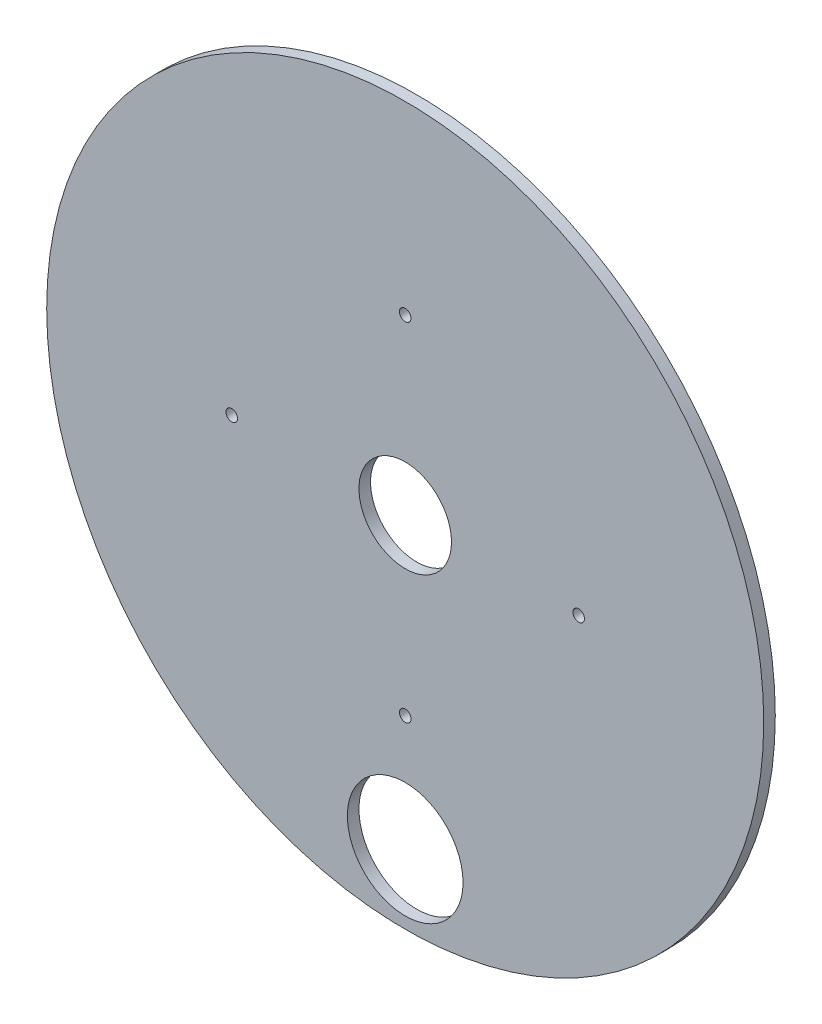
ISO-10303-21;
HEADER;
FILE_DESCRIPTION(('STEP AP214'),'2;1');
FILE_NAME('part.step','',(''),(''),'','','');
FILE_SCHEMA(('AUTOMOTIVE_DESIGN { 1 0 10303 214 1 1 1 1 }'));
ENDSEC;
DATA;
#1=APPLICATION_CONTEXT('core data for automotive mechanical design processes');
#2=APPLICATION_PROTOCOL_DEFINITION('international standard','automotive_design',2000,#1);
#3=PRODUCT_CONTEXT('',#1,'mechanical');
#4=PRODUCT('Part','Part','',(#3));
#5=PRODUCT_RELATED_PRODUCT_CATEGORY('part','',(#4));
#6=PRODUCT_DEFINITION_FORMATION('','',#4);
#7=PRODUCT_DEFINITION_CONTEXT('part definition',#1,'design');
#8=PRODUCT_DEFINITION('design','',#6,#7);
#9=PRODUCT_DEFINITION_SHAPE('','',#8);
#10=(LENGTH_UNIT() NAMED_UNIT(*) SI_UNIT(.MILLI.,.METRE.));
#11=(NAMED_UNIT(*) PLANE_ANGLE_UNIT() SI_UNIT($,.RADIAN.));
#12=(NAMED_UNIT(*) SI_UNIT($,.STERADIAN.) SOLID_ANGLE_UNIT());
#13=UNCERTAINTY_MEASURE_WITH_UNIT(LENGTH_MEASURE(1.E-05),#10,'distance_accuracy_value','');
#14=(GEOMETRIC_REPRESENTATION_CONTEXT(3) GLOBAL_UNCERTAINTY_ASSIGNED_CONTEXT((#13)) GLOBAL_UNIT_ASSIGNED_CONTEXT((#10,
#11,#12)) REPRESENTATION_CONTEXT('',''));
#15=CARTESIAN_POINT('',(0.,0.,0.));
#16=DIRECTION('',(0.,0.,1.));
#17=DIRECTION('',(1.,0.,0.));
#18=AXIS2_PLACEMENT_3D('',#15,#16,#17);
#19=CARTESIAN_POINT('',(0.,0.,0.));
#20=DIRECTION('',(0.,0.,1.));
#21=DIRECTION('',(1.,0.,0.));
#22=AXIS2_PLACEMENT_3D('',#19,#20,#21);
#23=PLANE('',#22);
#24=CARTESIAN_POINT('',(0.,0.,0.));
#25=DIRECTION('',(0.,0.,-1.));
#26=DIRECTION('',(-1.,0.,0.));
#27=AXIS2_PLACEMENT_3D('',#24,#25,#26);
#28=CIRCLE('',#27,20.);
#29=CARTESIAN_POINT('',(20.,0.,0.));
#30=VERTEX_POINT('',#29);
#31=EDGE_CURVE('E170',#30,#30,#28,.T.);
#32=ORIENTED_EDGE('',*,*,#31,.F.);
#33=EDGE_LOOP('',(#32));
#34=FACE_BOUND('',#33,.T.);
#35=CARTESIAN_POINT('',(-75.,0.,0.));
#36=DIRECTION('',(0.,0.,-1.));
#37=DIRECTION('',(-1.,0.,0.));
#38=AXIS2_PLACEMENT_3D('',#35,#36,#37);
#39=CIRCLE('',#38,2.5);
#40=CARTESIAN_POINT('',(-72.5,0.,0.));
#41=VERTEX_POINT('',#40);
#42=EDGE_CURVE('E174',#41,#41,#39,.T.);
#43=ORIENTED_EDGE('',*,*,#42,.F.);
#44=EDGE_LOOP('',(#43));
#45=FACE_BOUND('',#44,.T.);
#46=CARTESIAN_POINT('',(0.,-75.,0.));
#47=DIRECTION('',(0.,0.,-1.));
#48=DIRECTION('',(-1.,0.,0.));
#49=AXIS2_PLACEMENT_3D('',#46,#47,#48);
#50=CIRCLE('',#49,2.5);
#51=CARTESIAN_POINT('',(2.5,-75.,0.));
#52=VERTEX_POINT('',#51);
#53=EDGE_CURVE('E91',#52,#52,#50,.T.);
#54=ORIENTED_EDGE('',*,*,#53,.F.);
#55=EDGE_LOOP('',(#54));
#56=FACE_BOUND('',#55,.T.);
#57=CARTESIAN_POINT('',(75.,0.,0.));
#58=DIRECTION('',(0.,0.,-1.));
#59=DIRECTION('',(-1.,0.,0.));
#60=AXIS2_PLACEMENT_3D('',#57,#58,#59);
#61=CIRCLE('',#60,2.5);
#62=CARTESIAN_POINT('',(77.5,0.,0.));
#63=VERTEX_POINT('',#62);
#64=EDGE_CURVE('E94',#63,#63,#61,.T.);
#65=ORIENTED_EDGE('',*,*,#64,.F.);
#66=EDGE_LOOP('',(#65));
#67=FACE_BOUND('',#66,.T.);
#68=CARTESIAN_POINT('',(0.,75.,0.));
#69=DIRECTION('',(0.,0.,-1.));
#70=DIRECTION('',(-1.,0.,0.));
#71=AXIS2_PLACEMENT_3D('',#68,#69,#70);
#72=CIRCLE('',#71,2.5);
#73=CARTESIAN_POINT('',(2.5,75.,0.));
#74=VERTEX_POINT('',#73);
#75=EDGE_CURVE('E71',#74,#74,#72,.T.);
#76=ORIENTED_EDGE('',*,*,#75,.F.);
#77=EDGE_LOOP('',(#76));
#78=FACE_BOUND('',#77,.T.);
#79=CARTESIAN_POINT('',(0.,-125.,0.));
#80=DIRECTION('',(0.,0.,-1.));
#81=DIRECTION('',(-1.,0.,0.));
#82=AXIS2_PLACEMENT_3D('',#79,#80,#81);
#83=CIRCLE('',#82,25.);
#84=CARTESIAN_POINT('',(25.,-125.,0.));
#85=VERTEX_POINT('',#84);
#86=EDGE_CURVE('E103',#85,#85,#83,.T.);
#87=ORIENTED_EDGE('',*,*,#86,.F.);
#88=EDGE_LOOP('',(#87));
#89=FACE_BOUND('',#88,.T.);
#90=CARTESIAN_POINT('',(0.,0.,0.));
#91=DIRECTION('',(0.,0.,1.));
#92=DIRECTION('',(1.,0.,0.));
#93=AXIS2_PLACEMENT_3D('',#90,#91,#92);
#94=CIRCLE('',#93,155.);
#95=CARTESIAN_POINT('',(-155.,0.,0.));
#96=VERTEX_POINT('',#95);
#97=EDGE_CURVE('E11',#96,#96,#94,.T.);
#98=ORIENTED_EDGE('',*,*,#97,.F.);
#99=EDGE_LOOP('',(#98));
#100=FACE_BOUND('',#99,.T.);
#101=ADVANCED_FACE('F17',(#34,#45,#56,#67,#78,#89,#100),#23,.F.);
#102=CARTESIAN_POINT('',(0.,0.,5.));
#103=DIRECTION('',(0.,0.,1.));
#104=DIRECTION('',(1.,0.,0.));
#105=AXIS2_PLACEMENT_3D('',#102,#103,#104);
#106=PLANE('',#105);
#107=CARTESIAN_POINT('',(0.,0.,5.));
#108=DIRECTION('',(0.,0.,-1.));
#109=DIRECTION('',(-1.,0.,0.));
#110=AXIS2_PLACEMENT_3D('',#107,#108,#109);
#111=CIRCLE('',#110,20.);
#112=CARTESIAN_POINT('',(20.,0.,5.));
#113=VERTEX_POINT('',#112);
#114=EDGE_CURVE('E156',#113,#113,#111,.T.);
#115=ORIENTED_EDGE('',*,*,#114,.T.);
#116=EDGE_LOOP('',(#115));
#117=FACE_BOUND('',#116,.T.);
#118=CARTESIAN_POINT('',(-75.,0.,5.));
#119=DIRECTION('',(0.,0.,-1.));
#120=DIRECTION('',(-1.,0.,0.));
#121=AXIS2_PLACEMENT_3D('',#118,#119,#120);
#122=CIRCLE('',#121,2.5);
#123=CARTESIAN_POINT('',(-72.5,0.,5.));
#124=VERTEX_POINT('',#123);
#125=EDGE_CURVE('E173',#124,#124,#122,.T.);
#126=ORIENTED_EDGE('',*,*,#125,.T.);
#127=EDGE_LOOP('',(#126));
#128=FACE_BOUND('',#127,.T.);
#129=CARTESIAN_POINT('',(0.,-75.,5.));
#130=DIRECTION('',(0.,0.,-1.));
#131=DIRECTION('',(-1.,0.,0.));
#132=AXIS2_PLACEMENT_3D('',#129,#130,#131);
#133=CIRCLE('',#132,2.5);
#134=CARTESIAN_POINT('',(2.5,-75.,5.));
#135=VERTEX_POINT('',#134);
#136=EDGE_CURVE('E187',#135,#135,#133,.T.);
#137=ORIENTED_EDGE('',*,*,#136,.T.);
#138=EDGE_LOOP('',(#137));
#139=FACE_BOUND('',#138,.T.);
#140=CARTESIAN_POINT('',(75.,0.,5.));
#141=DIRECTION('',(0.,0.,-1.));
#142=DIRECTION('',(-1.,0.,0.));
#143=AXIS2_PLACEMENT_3D('',#140,#141,#142);
#144=CIRCLE('',#143,2.5);
#145=CARTESIAN_POINT('',(77.5,0.,5.));
#146=VERTEX_POINT('',#145);
#147=EDGE_CURVE('E185',#146,#146,#144,.T.);
#148=ORIENTED_EDGE('',*,*,#147,.T.);
#149=EDGE_LOOP('',(#148));
#150=FACE_BOUND('',#149,.T.);
#151=CARTESIAN_POINT('',(0.,75.,5.));
#152=DIRECTION('',(0.,0.,-1.));
#153=DIRECTION('',(-1.,0.,0.));
#154=AXIS2_PLACEMENT_3D('',#151,#152,#153);
#155=CIRCLE('',#154,2.5);
#156=CARTESIAN_POINT('',(2.5,75.,5.));
#157=VERTEX_POINT('',#156);
#158=EDGE_CURVE('E90',#157,#157,#155,.T.);
#159=ORIENTED_EDGE('',*,*,#158,.T.);
#160=EDGE_LOOP('',(#159));
#161=FACE_BOUND('',#160,.T.);
#162=CARTESIAN_POINT('',(0.,-125.,5.));
#163=DIRECTION('',(0.,0.,-1.));
#164=DIRECTION('',(-1.,0.,0.));
#165=AXIS2_PLACEMENT_3D('',#162,#163,#164);
#166=CIRCLE('',#165,25.);
#167=CARTESIAN_POINT('',(25.,-125.,5.));
#168=VERTEX_POINT('',#167);
#169=EDGE_CURVE('E78',#168,#168,#166,.T.);
#170=ORIENTED_EDGE('',*,*,#169,.T.);
#171=EDGE_LOOP('',(#170));
#172=FACE_BOUND('',#171,.T.);
#173=CARTESIAN_POINT('',(0.,0.,5.));
#174=DIRECTION('',(0.,0.,1.));
#175=DIRECTION('',(1.,0.,0.));
#176=AXIS2_PLACEMENT_3D('',#173,#174,#175);
#177=CIRCLE('',#176,155.);
#178=CARTESIAN_POINT('',(-155.,0.,5.));
#179=VERTEX_POINT('',#178);
#180=EDGE_CURVE('E110',#179,#179,#177,.T.);
#181=ORIENTED_EDGE('',*,*,#180,.T.);
#182=EDGE_LOOP('',(#181));
#183=FACE_BOUND('',#182,.T.);
#184=ADVANCED_FACE('F116',(#117,#128,#139,#150,#161,#172,#183),#106,.T.);
#185=CARTESIAN_POINT('',(0.,0.,0.));
#186=DIRECTION('',(0.,0.,1.));
#187=DIRECTION('',(1.,0.,0.));
#188=AXIS2_PLACEMENT_3D('',#185,#186,#187);
#189=CYLINDRICAL_SURFACE('',#188,155.);
#190=ORIENTED_EDGE('',*,*,#180,.F.);
#191=DIRECTION('',(0.,0.,-1.));
#192=VECTOR('',#191,1.);
#193=CARTESIAN_POINT('',(-155.,0.,0.));
#194=LINE('',#193,#192);
#195=EDGE_CURVE('E27',#179,#96,#194,.T.);
#196=ORIENTED_EDGE('',*,*,#195,.T.);
#197=ORIENTED_EDGE('',*,*,#97,.T.);
#198=ORIENTED_EDGE('',*,*,#195,.F.);
#199=EDGE_LOOP('',(#190,#196,#197,#198));
#200=FACE_BOUND('',#199,.T.);
#201=ADVANCED_FACE('F111',(#200),#189,.T.);
#202=CARTESIAN_POINT('',(0.,-125.,0.));
#203=DIRECTION('',(0.,0.,1.));
#204=DIRECTION('',(-1.,0.,0.));
#205=AXIS2_PLACEMENT_3D('',#202,#203,#204);
#206=CYLINDRICAL_SURFACE('',#205,25.);
#207=ORIENTED_EDGE('',*,*,#169,.F.);
#208=DIRECTION('',(0.,0.,-1.));
#209=VECTOR('',#208,1.);
#210=CARTESIAN_POINT('',(25.,-125.,0.));
#211=LINE('',#210,#209);
#212=EDGE_CURVE('E87',#168,#85,#211,.T.);
#213=ORIENTED_EDGE('',*,*,#212,.T.);
#214=ORIENTED_EDGE('',*,*,#86,.T.);
#215=ORIENTED_EDGE('',*,*,#212,.F.);
#216=EDGE_LOOP('',(#207,#213,#214,#215));
#217=FACE_BOUND('',#216,.T.);
#218=ADVANCED_FACE('F122',(#217),#206,.F.);
#219=CARTESIAN_POINT('',(0.,75.,0.));
#220=DIRECTION('',(0.,0.,1.));
#221=DIRECTION('',(-1.,0.,0.));
#222=AXIS2_PLACEMENT_3D('',#219,#220,#221);
#223=CYLINDRICAL_SURFACE('',#222,2.5);
#224=ORIENTED_EDGE('',*,*,#158,.F.);
#225=DIRECTION('',(0.,0.,-1.));
#226=VECTOR('',#225,1.);
#227=CARTESIAN_POINT('',(2.5,75.,0.));
#228=LINE('',#227,#226);
#229=EDGE_CURVE('E74',#157,#74,#228,.T.);
#230=ORIENTED_EDGE('',*,*,#229,.T.);
#231=ORIENTED_EDGE('',*,*,#75,.T.);
#232=ORIENTED_EDGE('',*,*,#229,.F.);
#233=EDGE_LOOP('',(#224,#230,#231,#232));
#234=FACE_BOUND('',#233,.T.);
#235=ADVANCED_FACE('F72',(#234),#223,.F.);
#236=CARTESIAN_POINT('',(75.,0.,0.));
#237=DIRECTION('',(0.,0.,1.));
#238=DIRECTION('',(-1.,0.,0.));
#239=AXIS2_PLACEMENT_3D('',#236,#237,#238);
#240=CYLINDRICAL_SURFACE('',#239,2.5);
#241=ORIENTED_EDGE('',*,*,#147,.F.);
#242=DIRECTION('',(0.,0.,-1.));
#243=VECTOR('',#242,1.);
#244=CARTESIAN_POINT('',(77.5,0.,0.));
#245=LINE('',#244,#243);
#246=EDGE_CURVE('E100',#146,#63,#245,.T.);
#247=ORIENTED_EDGE('',*,*,#246,.T.);
#248=ORIENTED_EDGE('',*,*,#64,.T.);
#249=ORIENTED_EDGE('',*,*,#246,.F.);
#250=EDGE_LOOP('',(#241,#247,#248,#249));
#251=FACE_BOUND('',#250,.T.);
#252=ADVANCED_FACE('F134',(#251),#240,.F.);
#253=CARTESIAN_POINT('',(0.,-75.,0.));
#254=DIRECTION('',(0.,0.,1.));
#255=DIRECTION('',(-1.,0.,0.));
#256=AXIS2_PLACEMENT_3D('',#253,#254,#255);
#257=CYLINDRICAL_SURFACE('',#256,2.5);
#258=ORIENTED_EDGE('',*,*,#136,.F.);
#259=DIRECTION('',(0.,0.,-1.));
#260=VECTOR('',#259,1.);
#261=CARTESIAN_POINT('',(2.5,-75.,0.));
#262=LINE('',#261,#260);
#263=EDGE_CURVE('E193',#135,#52,#262,.T.);
#264=ORIENTED_EDGE('',*,*,#263,.T.);
#265=ORIENTED_EDGE('',*,*,#53,.T.);
#266=ORIENTED_EDGE('',*,*,#263,.F.);
#267=EDGE_LOOP('',(#258,#264,#265,#266));
#268=FACE_BOUND('',#267,.T.);
#269=ADVANCED_FACE('F140',(#268),#257,.F.);
#270=CARTESIAN_POINT('',(-75.,0.,0.));
#271=DIRECTION('',(0.,0.,1.));
#272=DIRECTION('',(-1.,0.,0.));
#273=AXIS2_PLACEMENT_3D('',#270,#271,#272);
#274=CYLINDRICAL_SURFACE('',#273,2.5);
#275=ORIENTED_EDGE('',*,*,#125,.F.);
#276=DIRECTION('',(0.,0.,-1.));
#277=VECTOR('',#276,1.);
#278=CARTESIAN_POINT('',(-72.5,0.,0.));
#279=LINE('',#278,#277);
#280=EDGE_CURVE('E168',#124,#41,#279,.T.);
#281=ORIENTED_EDGE('',*,*,#280,.T.);
#282=ORIENTED_EDGE('',*,*,#42,.T.);
#283=ORIENTED_EDGE('',*,*,#280,.F.);
#284=EDGE_LOOP('',(#275,#281,#282,#283));
#285=FACE_BOUND('',#284,.T.);
#286=ADVANCED_FACE('F142',(#285),#274,.F.);
#287=CARTESIAN_POINT('',(0.,0.,0.));
#288=DIRECTION('',(0.,0.,1.));
#289=DIRECTION('',(-1.,0.,0.));
#290=AXIS2_PLACEMENT_3D('',#287,#288,#289);
#291=CYLINDRICAL_SURFACE('',#290,20.);
#292=ORIENTED_EDGE('',*,*,#114,.F.);
#293=DIRECTION('',(0.,0.,-1.));
#294=VECTOR('',#293,1.);
#295=CARTESIAN_POINT('',(20.,0.,0.));
#296=LINE('',#295,#294);
#297=EDGE_CURVE('E157',#113,#30,#296,.T.);
#298=ORIENTED_EDGE('',*,*,#297,.T.);
#299=ORIENTED_EDGE('',*,*,#31,.T.);
#300=ORIENTED_EDGE('',*,*,#297,.F.);
#301=EDGE_LOOP('',(#292,#298,#299,#300));
#302=FACE_BOUND('',#301,.T.);
#303=ADVANCED_FACE('F148',(#302),#291,.F.);
#304=CLOSED_SHELL('',(#101,#184,#201,#218,#235,#252,#269,#286,#303));
#305=MANIFOLD_SOLID_BREP('B1',#304);
#306=ADVANCED_BREP_SHAPE_REPRESENTATION('',(#18,#305),#14);
#307=SHAPE_DEFINITION_REPRESENTATION(#9,#306);
ENDSEC;
END-ISO-10303-21;
